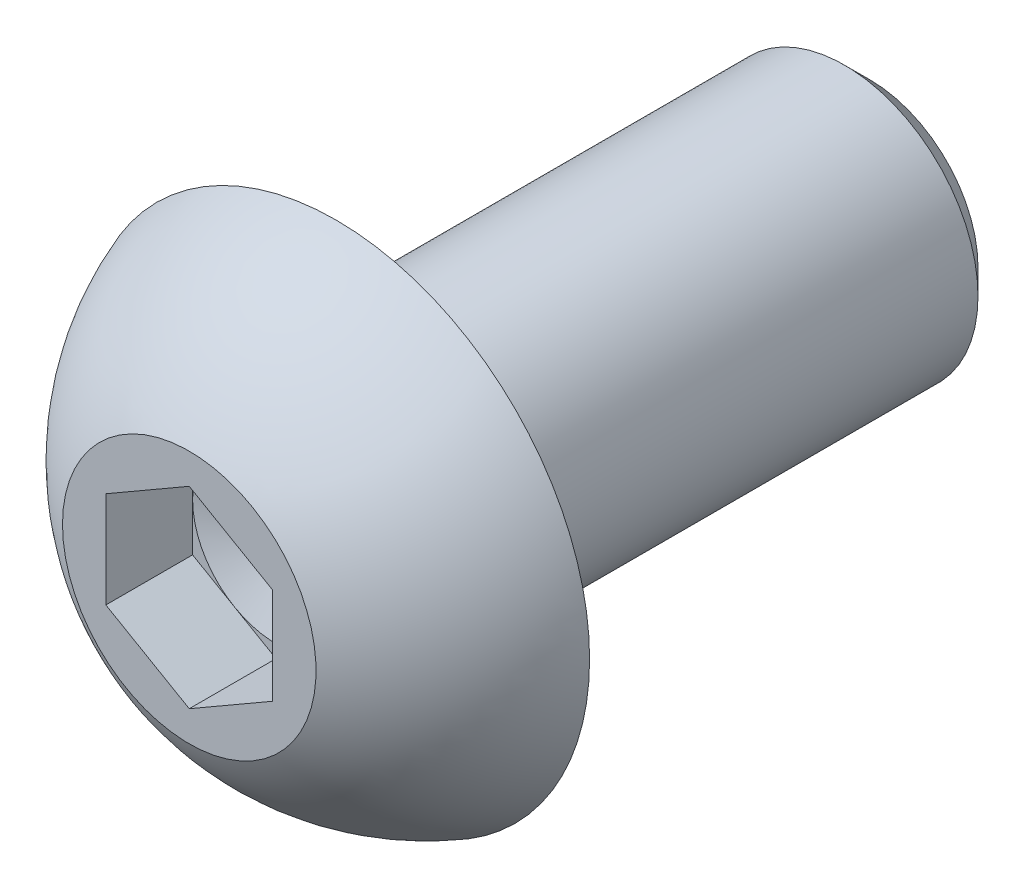
ISO-10303-21;
HEADER;
FILE_DESCRIPTION(('STEP AP214'),'2;1');
FILE_NAME('part.step','',(''),(''),'','','');
FILE_SCHEMA(('AUTOMOTIVE_DESIGN { 1 0 10303 214 1 1 1 1 }'));
ENDSEC;
DATA;
#1=APPLICATION_CONTEXT('core data for automotive mechanical design processes');
#2=APPLICATION_PROTOCOL_DEFINITION('international standard','automotive_design',2000,#1);
#3=PRODUCT_CONTEXT('',#1,'mechanical');
#4=PRODUCT('Part','Part','',(#3));
#5=PRODUCT_RELATED_PRODUCT_CATEGORY('part','',(#4));
#6=PRODUCT_DEFINITION_FORMATION('','',#4);
#7=PRODUCT_DEFINITION_CONTEXT('part definition',#1,'design');
#8=PRODUCT_DEFINITION('design','',#6,#7);
#9=PRODUCT_DEFINITION_SHAPE('','',#8);
#10=(LENGTH_UNIT() NAMED_UNIT(*) SI_UNIT(.MILLI.,.METRE.));
#11=(NAMED_UNIT(*) PLANE_ANGLE_UNIT() SI_UNIT($,.RADIAN.));
#12=(NAMED_UNIT(*) SI_UNIT($,.STERADIAN.) SOLID_ANGLE_UNIT());
#13=UNCERTAINTY_MEASURE_WITH_UNIT(LENGTH_MEASURE(1.E-05),#10,'distance_accuracy_value','');
#14=(GEOMETRIC_REPRESENTATION_CONTEXT(3) GLOBAL_UNCERTAINTY_ASSIGNED_CONTEXT((#13)) GLOBAL_UNIT_ASSIGNED_CONTEXT((#10,
#11,#12)) REPRESENTATION_CONTEXT('',''));
#15=CARTESIAN_POINT('',(0.,0.,0.));
#16=DIRECTION('',(0.,0.,1.));
#17=DIRECTION('',(1.,0.,0.));
#18=AXIS2_PLACEMENT_3D('',#15,#16,#17);
#19=CARTESIAN_POINT('',(0.,0.,-10.2));
#20=DIRECTION('',(0.,0.,1.));
#21=DIRECTION('',(1.,0.,0.));
#22=AXIS2_PLACEMENT_3D('',#19,#20,#21);
#23=CONICAL_SURFACE('',#22,1.6211138875,0.785398163397448);
#24=CARTESIAN_POINT('',(0.,0.,-10.2));
#25=DIRECTION('',(0.,0.,-1.));
#26=DIRECTION('',(1.,0.,0.));
#27=AXIS2_PLACEMENT_3D('',#24,#25,#26);
#28=CIRCLE('',#27,1.6211138875);
#29=CARTESIAN_POINT('',(1.6211138875,0.,-10.2));
#30=VERTEX_POINT('',#29);
#31=EDGE_CURVE('E313',#30,#30,#28,.T.);
#32=ORIENTED_EDGE('',*,*,#31,.F.);
#33=EDGE_LOOP('',(#32));
#34=FACE_BOUND('',#33,.T.);
#35=CARTESIAN_POINT('',(0.,0.,-9.8211138875));
#36=DIRECTION('',(0.,0.,1.));
#37=DIRECTION('',(1.,0.,0.));
#38=AXIS2_PLACEMENT_3D('',#35,#36,#37);
#39=CIRCLE('',#38,2.);
#40=CARTESIAN_POINT('',(2.,0.,-9.8211138875));
#41=VERTEX_POINT('',#40);
#42=EDGE_CURVE('E310',#41,#41,#39,.T.);
#43=ORIENTED_EDGE('',*,*,#42,.F.);
#44=EDGE_LOOP('',(#43));
#45=FACE_BOUND('',#44,.T.);
#46=ADVANCED_FACE('F17',(#34,#45),#23,.T.);
#47=CARTESIAN_POINT('',(0.,0.,-1.3));
#48=DIRECTION('',(0.,0.,1.));
#49=DIRECTION('',(1.,0.,0.));
#50=AXIS2_PLACEMENT_3D('',#47,#48,#49);
#51=CONICAL_SURFACE('',#50,1.25,1.22173047639603);
#52=CARTESIAN_POINT('',(0.,0.,-1.3));
#53=DIRECTION('',(0.,0.,1.));
#54=DIRECTION('',(1.,0.,0.));
#55=AXIS2_PLACEMENT_3D('',#52,#53,#54);
#56=CIRCLE('',#55,1.25);
#57=CARTESIAN_POINT('',(1.25,0.,-1.3));
#58=VERTEX_POINT('',#57);
#59=CARTESIAN_POINT('',(0.625,1.08253175473055,-1.3));
#60=VERTEX_POINT('',#59);
#61=EDGE_CURVE('E221',#58,#60,#56,.T.);
#62=ORIENTED_EDGE('',*,*,#61,.T.);
#63=CARTESIAN_POINT('',(0.,0.,-1.3));
#64=DIRECTION('',(0.,0.,1.));
#65=DIRECTION('',(1.,0.,0.));
#66=AXIS2_PLACEMENT_3D('',#63,#64,#65);
#67=CIRCLE('',#66,1.25);
#68=CARTESIAN_POINT('',(-0.625,1.08253175473055,-1.3));
#69=VERTEX_POINT('',#68);
#70=EDGE_CURVE('E235',#60,#69,#67,.T.);
#71=ORIENTED_EDGE('',*,*,#70,.T.);
#72=CARTESIAN_POINT('',(0.,0.,-1.3));
#73=DIRECTION('',(0.,0.,1.));
#74=DIRECTION('',(1.,0.,0.));
#75=AXIS2_PLACEMENT_3D('',#72,#73,#74);
#76=CIRCLE('',#75,1.25);
#77=CARTESIAN_POINT('',(-1.25,0.,-1.3));
#78=VERTEX_POINT('',#77);
#79=EDGE_CURVE('E257',#69,#78,#76,.T.);
#80=ORIENTED_EDGE('',*,*,#79,.T.);
#81=CARTESIAN_POINT('',(0.,0.,-1.3));
#82=DIRECTION('',(0.,0.,1.));
#83=DIRECTION('',(1.,0.,0.));
#84=AXIS2_PLACEMENT_3D('',#81,#82,#83);
#85=CIRCLE('',#84,1.25);
#86=CARTESIAN_POINT('',(-0.625,-1.08253175473055,-1.3));
#87=VERTEX_POINT('',#86);
#88=EDGE_CURVE('E243',#78,#87,#85,.T.);
#89=ORIENTED_EDGE('',*,*,#88,.T.);
#90=CARTESIAN_POINT('',(0.,0.,-1.3));
#91=DIRECTION('',(0.,0.,1.));
#92=DIRECTION('',(1.,0.,0.));
#93=AXIS2_PLACEMENT_3D('',#90,#91,#92);
#94=CIRCLE('',#93,1.25);
#95=CARTESIAN_POINT('',(0.625,-1.08253175473055,-1.3));
#96=VERTEX_POINT('',#95);
#97=EDGE_CURVE('E262',#87,#96,#94,.T.);
#98=ORIENTED_EDGE('',*,*,#97,.T.);
#99=CARTESIAN_POINT('',(0.,0.,-1.3));
#100=DIRECTION('',(0.,0.,1.));
#101=DIRECTION('',(1.,0.,0.));
#102=AXIS2_PLACEMENT_3D('',#99,#100,#101);
#103=CIRCLE('',#102,1.25);
#104=EDGE_CURVE('E11',#96,#58,#103,.T.);
#105=ORIENTED_EDGE('',*,*,#104,.T.);
#106=EDGE_LOOP('',(#62,#71,#80,#89,#98,#105));
#107=FACE_BOUND('',#106,.T.);
#108=CARTESIAN_POINT('',(0.,0.,-1.75496279283276));
#109=VERTEX_POINT('',#108);
#110=VERTEX_LOOP('',#109);
#111=FACE_BOUND('',#110,.T.);
#112=ADVANCED_FACE('F136',(#107,#111),#51,.F.);
#113=CARTESIAN_POINT('',(0.,0.,-1.3));
#114=DIRECTION('',(0.,0.,1.));
#115=DIRECTION('',(1.,0.,0.));
#116=AXIS2_PLACEMENT_3D('',#113,#114,#115);
#117=PLANE('',#116);
#118=ORIENTED_EDGE('',*,*,#104,.F.);
#119=DIRECTION('',(-0.866025403784439,-0.5,0.));
#120=VECTOR('',#119,1.);
#121=CARTESIAN_POINT('',(0.625,-1.08253175473055,-1.3));
#122=LINE('',#121,#120);
#123=CARTESIAN_POINT('',(1.25,-0.721687836487032,-1.3));
#124=VERTEX_POINT('',#123);
#125=EDGE_CURVE('E324',#124,#96,#122,.T.);
#126=ORIENTED_EDGE('',*,*,#125,.F.);
#127=DIRECTION('',(0.,-1.,0.));
#128=VECTOR('',#127,1.);
#129=CARTESIAN_POINT('',(1.25,0.,-1.3));
#130=LINE('',#129,#128);
#131=EDGE_CURVE('E26',#58,#124,#130,.T.);
#132=ORIENTED_EDGE('',*,*,#131,.F.);
#133=EDGE_LOOP('',(#118,#126,#132));
#134=FACE_BOUND('',#133,.T.);
#135=ADVANCED_FACE('F138',(#134),#117,.T.);
#136=CARTESIAN_POINT('',(1.25,0.,-1.3));
#137=DIRECTION('',(-1.,0.,0.));
#138=DIRECTION('',(0.,0.,1.));
#139=AXIS2_PLACEMENT_3D('',#136,#137,#138);
#140=PLANE('',#139);
#141=DIRECTION('',(0.,-1.,0.));
#142=VECTOR('',#141,1.);
#143=CARTESIAN_POINT('',(1.25,0.,0.));
#144=LINE('',#143,#142);
#145=CARTESIAN_POINT('',(1.25,0.721687836487032,0.));
#146=VERTEX_POINT('',#145);
#147=CARTESIAN_POINT('',(1.25,-0.721687836487032,0.));
#148=VERTEX_POINT('',#147);
#149=EDGE_CURVE('E284',#146,#148,#144,.T.);
#150=ORIENTED_EDGE('',*,*,#149,.F.);
#151=DIRECTION('',(0.,0.,1.));
#152=VECTOR('',#151,1.);
#153=CARTESIAN_POINT('',(1.25,0.721687836487032,-1.3));
#154=LINE('',#153,#152);
#155=CARTESIAN_POINT('',(1.25,0.721687836487032,-1.3));
#156=VERTEX_POINT('',#155);
#157=EDGE_CURVE('E314',#156,#146,#154,.T.);
#158=ORIENTED_EDGE('',*,*,#157,.F.);
#159=DIRECTION('',(0.,-1.,0.));
#160=VECTOR('',#159,1.);
#161=CARTESIAN_POINT('',(1.25,0.,-1.3));
#162=LINE('',#161,#160);
#163=EDGE_CURVE('E222',#156,#58,#162,.T.);
#164=ORIENTED_EDGE('',*,*,#163,.T.);
#165=ORIENTED_EDGE('',*,*,#131,.T.);
#166=DIRECTION('',(0.,0.,1.));
#167=VECTOR('',#166,1.);
#168=CARTESIAN_POINT('',(1.25,-0.721687836487032,-1.3));
#169=LINE('',#168,#167);
#170=EDGE_CURVE('E328',#124,#148,#169,.T.);
#171=ORIENTED_EDGE('',*,*,#170,.T.);
#172=EDGE_LOOP('',(#150,#158,#164,#165,#171));
#173=FACE_BOUND('',#172,.T.);
#174=ADVANCED_FACE('F145',(#173),#140,.T.);
#175=CARTESIAN_POINT('',(0.625,-1.08253175473055,-1.3));
#176=DIRECTION('',(-0.5,0.866025403784439,0.));
#177=DIRECTION('',(0.,0.,1.));
#178=AXIS2_PLACEMENT_3D('',#175,#176,#177);
#179=PLANE('',#178);
#180=DIRECTION('',(-0.866025403784439,-0.5,0.));
#181=VECTOR('',#180,1.);
#182=CARTESIAN_POINT('',(0.625,-1.08253175473055,0.));
#183=LINE('',#182,#181);
#184=CARTESIAN_POINT('',(0.,-1.44337567297406,0.));
#185=VERTEX_POINT('',#184);
#186=EDGE_CURVE('E288',#148,#185,#183,.T.);
#187=ORIENTED_EDGE('',*,*,#186,.F.);
#188=ORIENTED_EDGE('',*,*,#170,.F.);
#189=ORIENTED_EDGE('',*,*,#125,.T.);
#190=DIRECTION('',(-0.866025403784439,-0.5,0.));
#191=VECTOR('',#190,1.);
#192=CARTESIAN_POINT('',(0.625,-1.08253175473055,-1.3));
#193=LINE('',#192,#191);
#194=CARTESIAN_POINT('',(0.,-1.44337567297406,-1.3));
#195=VERTEX_POINT('',#194);
#196=EDGE_CURVE('E248',#96,#195,#193,.T.);
#197=ORIENTED_EDGE('',*,*,#196,.T.);
#198=DIRECTION('',(0.,0.,1.));
#199=VECTOR('',#198,1.);
#200=CARTESIAN_POINT('',(0.,-1.44337567297406,-1.3));
#201=LINE('',#200,#199);
#202=EDGE_CURVE('E336',#195,#185,#201,.T.);
#203=ORIENTED_EDGE('',*,*,#202,.T.);
#204=EDGE_LOOP('',(#187,#188,#189,#197,#203));
#205=FACE_BOUND('',#204,.T.);
#206=ADVANCED_FACE('F152',(#205),#179,.T.);
#207=CARTESIAN_POINT('',(-0.625,-1.08253175473055,-1.3));
#208=DIRECTION('',(0.5,0.866025403784439,0.));
#209=DIRECTION('',(0.,0.,-1.));
#210=AXIS2_PLACEMENT_3D('',#207,#208,#209);
#211=PLANE('',#210);
#212=DIRECTION('',(-0.866025403784439,0.5,0.));
#213=VECTOR('',#212,1.);
#214=CARTESIAN_POINT('',(-0.625,-1.08253175473055,0.));
#215=LINE('',#214,#213);
#216=CARTESIAN_POINT('',(-1.25,-0.721687836487033,0.));
#217=VERTEX_POINT('',#216);
#218=EDGE_CURVE('E292',#185,#217,#215,.T.);
#219=ORIENTED_EDGE('',*,*,#218,.F.);
#220=ORIENTED_EDGE('',*,*,#202,.F.);
#221=DIRECTION('',(-0.866025403784439,0.5,0.));
#222=VECTOR('',#221,1.);
#223=CARTESIAN_POINT('',(-0.625,-1.08253175473055,-1.3));
#224=LINE('',#223,#222);
#225=EDGE_CURVE('E253',#195,#87,#224,.T.);
#226=ORIENTED_EDGE('',*,*,#225,.T.);
#227=DIRECTION('',(-0.866025403784439,0.5,0.));
#228=VECTOR('',#227,1.);
#229=CARTESIAN_POINT('',(-0.625,-1.08253175473055,-1.3));
#230=LINE('',#229,#228);
#231=CARTESIAN_POINT('',(-1.25,-0.721687836487033,-1.3));
#232=VERTEX_POINT('',#231);
#233=EDGE_CURVE('E258',#87,#232,#230,.T.);
#234=ORIENTED_EDGE('',*,*,#233,.T.);
#235=DIRECTION('',(0.,0.,1.));
#236=VECTOR('',#235,1.);
#237=CARTESIAN_POINT('',(-1.25,-0.721687836487033,-1.3));
#238=LINE('',#237,#236);
#239=EDGE_CURVE('E333',#232,#217,#238,.T.);
#240=ORIENTED_EDGE('',*,*,#239,.T.);
#241=EDGE_LOOP('',(#219,#220,#226,#234,#240));
#242=FACE_BOUND('',#241,.T.);
#243=ADVANCED_FACE('F153',(#242),#211,.T.);
#244=CARTESIAN_POINT('',(-1.25,0.,-1.3));
#245=DIRECTION('',(1.,0.,0.));
#246=DIRECTION('',(0.,1.,0.));
#247=AXIS2_PLACEMENT_3D('',#244,#245,#246);
#248=PLANE('',#247);
#249=DIRECTION('',(0.,1.,0.));
#250=VECTOR('',#249,1.);
#251=CARTESIAN_POINT('',(-1.25,0.,0.));
#252=LINE('',#251,#250);
#253=CARTESIAN_POINT('',(-1.25,0.721687836487032,0.));
#254=VERTEX_POINT('',#253);
#255=EDGE_CURVE('E296',#217,#254,#252,.T.);
#256=ORIENTED_EDGE('',*,*,#255,.F.);
#257=ORIENTED_EDGE('',*,*,#239,.F.);
#258=DIRECTION('',(0.,1.,0.));
#259=VECTOR('',#258,1.);
#260=CARTESIAN_POINT('',(-1.25,0.,-1.3));
#261=LINE('',#260,#259);
#262=EDGE_CURVE('E263',#232,#78,#261,.T.);
#263=ORIENTED_EDGE('',*,*,#262,.T.);
#264=DIRECTION('',(0.,1.,0.));
#265=VECTOR('',#264,1.);
#266=CARTESIAN_POINT('',(-1.25,0.,-1.3));
#267=LINE('',#266,#265);
#268=CARTESIAN_POINT('',(-1.25,0.721687836487032,-1.3));
#269=VERTEX_POINT('',#268);
#270=EDGE_CURVE('E239',#78,#269,#267,.T.);
#271=ORIENTED_EDGE('',*,*,#270,.T.);
#272=DIRECTION('',(0.,0.,1.));
#273=VECTOR('',#272,1.);
#274=CARTESIAN_POINT('',(-1.25,0.721687836487032,-1.3));
#275=LINE('',#274,#273);
#276=EDGE_CURVE('E317',#269,#254,#275,.T.);
#277=ORIENTED_EDGE('',*,*,#276,.T.);
#278=EDGE_LOOP('',(#256,#257,#263,#271,#277));
#279=FACE_BOUND('',#278,.T.);
#280=ADVANCED_FACE('F156',(#279),#248,.T.);
#281=CARTESIAN_POINT('',(-0.625,1.08253175473055,-1.3));
#282=DIRECTION('',(0.5,-0.866025403784439,0.));
#283=DIRECTION('',(0.,0.,-1.));
#284=AXIS2_PLACEMENT_3D('',#281,#282,#283);
#285=PLANE('',#284);
#286=DIRECTION('',(0.866025403784439,0.5,0.));
#287=VECTOR('',#286,1.);
#288=CARTESIAN_POINT('',(-0.625,1.08253175473055,0.));
#289=LINE('',#288,#287);
#290=CARTESIAN_POINT('',(0.,1.44337567297406,0.));
#291=VERTEX_POINT('',#290);
#292=EDGE_CURVE('E300',#254,#291,#289,.T.);
#293=ORIENTED_EDGE('',*,*,#292,.F.);
#294=ORIENTED_EDGE('',*,*,#276,.F.);
#295=DIRECTION('',(0.866025403784439,0.5,0.));
#296=VECTOR('',#295,1.);
#297=CARTESIAN_POINT('',(-0.625,1.08253175473055,-1.3));
#298=LINE('',#297,#296);
#299=EDGE_CURVE('E244',#269,#69,#298,.T.);
#300=ORIENTED_EDGE('',*,*,#299,.T.);
#301=DIRECTION('',(0.866025403784439,0.5,0.));
#302=VECTOR('',#301,1.);
#303=CARTESIAN_POINT('',(-0.625,1.08253175473055,-1.3));
#304=LINE('',#303,#302);
#305=CARTESIAN_POINT('',(0.,1.44337567297406,-1.3));
#306=VERTEX_POINT('',#305);
#307=EDGE_CURVE('E247',#69,#306,#304,.T.);
#308=ORIENTED_EDGE('',*,*,#307,.T.);
#309=DIRECTION('',(0.,0.,1.));
#310=VECTOR('',#309,1.);
#311=CARTESIAN_POINT('',(0.,1.44337567297406,-1.3));
#312=LINE('',#311,#310);
#313=EDGE_CURVE('E318',#306,#291,#312,.T.);
#314=ORIENTED_EDGE('',*,*,#313,.T.);
#315=EDGE_LOOP('',(#293,#294,#300,#308,#314));
#316=FACE_BOUND('',#315,.T.);
#317=ADVANCED_FACE('F165',(#316),#285,.T.);
#318=CARTESIAN_POINT('',(0.625,1.08253175473055,-1.3));
#319=DIRECTION('',(-0.5,-0.866025403784439,0.));
#320=DIRECTION('',(-0.866025403784439,0.5,0.));
#321=AXIS2_PLACEMENT_3D('',#318,#319,#320);
#322=PLANE('',#321);
#323=DIRECTION('',(0.866025403784439,-0.5,0.));
#324=VECTOR('',#323,1.);
#325=CARTESIAN_POINT('',(0.625,1.08253175473055,0.));
#326=LINE('',#325,#324);
#327=EDGE_CURVE('E280',#291,#146,#326,.T.);
#328=ORIENTED_EDGE('',*,*,#327,.F.);
#329=ORIENTED_EDGE('',*,*,#313,.F.);
#330=DIRECTION('',(0.866025403784439,-0.5,0.));
#331=VECTOR('',#330,1.);
#332=CARTESIAN_POINT('',(0.625,1.08253175473055,-1.3));
#333=LINE('',#332,#331);
#334=EDGE_CURVE('E238',#306,#60,#333,.T.);
#335=ORIENTED_EDGE('',*,*,#334,.T.);
#336=DIRECTION('',(0.866025403784439,-0.5,0.));
#337=VECTOR('',#336,1.);
#338=CARTESIAN_POINT('',(0.625,1.08253175473055,-1.3));
#339=LINE('',#338,#337);
#340=EDGE_CURVE('E224',#60,#156,#339,.T.);
#341=ORIENTED_EDGE('',*,*,#340,.T.);
#342=ORIENTED_EDGE('',*,*,#157,.T.);
#343=EDGE_LOOP('',(#328,#329,#335,#341,#342));
#344=FACE_BOUND('',#343,.T.);
#345=ADVANCED_FACE('F161',(#344),#322,.T.);
#346=CARTESIAN_POINT('',(-1.97727344006639,0.,-2.2));
#347=DIRECTION('',(0.,0.,-1.));
#348=DIRECTION('',(0.,-1.,0.));
#349=AXIS2_PLACEMENT_3D('',#346,#347,#348);
#350=PLANE('',#349);
#351=CARTESIAN_POINT('',(0.,0.,-2.2));
#352=DIRECTION('',(0.,0.,-1.));
#353=DIRECTION('',(-1.,0.,0.));
#354=AXIS2_PLACEMENT_3D('',#351,#352,#353);
#355=CIRCLE('',#354,2.2);
#356=CARTESIAN_POINT('',(-2.2,0.,-2.2));
#357=VERTEX_POINT('',#356);
#358=EDGE_CURVE('E304',#357,#357,#355,.T.);
#359=ORIENTED_EDGE('',*,*,#358,.F.);
#360=EDGE_LOOP('',(#359));
#361=FACE_BOUND('',#360,.T.);
#362=CARTESIAN_POINT('',(0.,0.,-2.2));
#363=DIRECTION('',(0.,0.,-1.));
#364=DIRECTION('',(-1.,0.,0.));
#365=AXIS2_PLACEMENT_3D('',#362,#363,#364);
#366=CIRCLE('',#365,3.8);
#367=CARTESIAN_POINT('',(-3.8,0.,-2.2));
#368=VERTEX_POINT('',#367);
#369=EDGE_CURVE('E321',#368,#368,#366,.T.);
#370=ORIENTED_EDGE('',*,*,#369,.T.);
#371=EDGE_LOOP('',(#370));
#372=FACE_BOUND('',#371,.T.);
#373=ADVANCED_FACE('F164',(#361,#372),#350,.T.);
#374=CARTESIAN_POINT('',(0.,0.,-3.56136363636364));
#375=DIRECTION('',(0.,0.,-1.));
#376=DIRECTION('',(-1.,0.,0.));
#377=AXIS2_PLACEMENT_3D('',#374,#375,#376);
#378=SPHERICAL_SURFACE('',#377,4.03649736162595);
#379=CARTESIAN_POINT('',(0.,0.,0.));
#380=DIRECTION('',(0.,0.,-1.));
#381=DIRECTION('',(-1.,0.,0.));
#382=AXIS2_PLACEMENT_3D('',#379,#380,#381);
#383=CIRCLE('',#382,1.9);
#384=CARTESIAN_POINT('',(-1.9,0.,0.));
#385=VERTEX_POINT('',#384);
#386=EDGE_CURVE('E252',#385,#385,#383,.T.);
#387=ORIENTED_EDGE('',*,*,#386,.T.);
#388=EDGE_LOOP('',(#387));
#389=FACE_BOUND('',#388,.T.);
#390=ORIENTED_EDGE('',*,*,#369,.F.);
#391=EDGE_LOOP('',(#390));
#392=FACE_BOUND('',#391,.T.);
#393=ADVANCED_FACE('F167',(#389,#392),#378,.T.);
#394=CARTESIAN_POINT('',(-0.87081455068829,0.,-10.2));
#395=DIRECTION('',(0.,0.,1.));
#396=DIRECTION('',(1.,0.,0.));
#397=AXIS2_PLACEMENT_3D('',#394,#395,#396);
#398=PLANE('',#397);
#399=ORIENTED_EDGE('',*,*,#31,.T.);
#400=EDGE_LOOP('',(#399));
#401=FACE_BOUND('',#400,.T.);
#402=ADVANCED_FACE('F170',(#401),#398,.F.);
#403=CARTESIAN_POINT('',(0.,0.,1.27209592840993));
#404=DIRECTION('',(0.,0.,-1.));
#405=DIRECTION('',(-1.,0.,0.));
#406=AXIS2_PLACEMENT_3D('',#403,#404,#405);
#407=CYLINDRICAL_SURFACE('',#406,2.);
#408=CARTESIAN_POINT('',(0.,0.,-2.4));
#409=DIRECTION('',(0.,0.,-1.));
#410=DIRECTION('',(-1.,0.,0.));
#411=AXIS2_PLACEMENT_3D('',#408,#409,#410);
#412=CIRCLE('',#411,2.);
#413=CARTESIAN_POINT('',(-2.,0.,-2.4));
#414=VERTEX_POINT('',#413);
#415=EDGE_CURVE('E307',#414,#414,#412,.T.);
#416=ORIENTED_EDGE('',*,*,#415,.T.);
#417=EDGE_LOOP('',(#416));
#418=FACE_BOUND('',#417,.T.);
#419=ORIENTED_EDGE('',*,*,#42,.T.);
#420=EDGE_LOOP('',(#419));
#421=FACE_BOUND('',#420,.T.);
#422=ADVANCED_FACE('F172',(#418,#421),#407,.T.);
#423=CARTESIAN_POINT('',(0.,0.,-2.4));
#424=DIRECTION('',(0.,0.,-1.));
#425=DIRECTION('',(-1.,0.,0.));
#426=AXIS2_PLACEMENT_3D('',#423,#424,#425);
#427=TOROIDAL_SURFACE('',#426,2.2,0.2);
#428=ORIENTED_EDGE('',*,*,#415,.F.);
#429=EDGE_LOOP('',(#428));
#430=FACE_BOUND('',#429,.T.);
#431=ORIENTED_EDGE('',*,*,#358,.T.);
#432=EDGE_LOOP('',(#431));
#433=FACE_BOUND('',#432,.T.);
#434=ADVANCED_FACE('F175',(#430,#433),#427,.F.);
#435=CARTESIAN_POINT('',(-0.65,0.,0.));
#436=DIRECTION('',(0.,0.,-1.));
#437=DIRECTION('',(0.,-1.,0.));
#438=AXIS2_PLACEMENT_3D('',#435,#436,#437);
#439=PLANE('',#438);
#440=ORIENTED_EDGE('',*,*,#327,.T.);
#441=ORIENTED_EDGE('',*,*,#149,.T.);
#442=ORIENTED_EDGE('',*,*,#186,.T.);
#443=ORIENTED_EDGE('',*,*,#218,.T.);
#444=ORIENTED_EDGE('',*,*,#255,.T.);
#445=ORIENTED_EDGE('',*,*,#292,.T.);
#446=EDGE_LOOP('',(#440,#441,#442,#443,#444,#445));
#447=FACE_BOUND('',#446,.T.);
#448=ORIENTED_EDGE('',*,*,#386,.F.);
#449=EDGE_LOOP('',(#448));
#450=FACE_BOUND('',#449,.T.);
#451=ADVANCED_FACE('F180',(#447,#450),#439,.F.);
#452=CARTESIAN_POINT('',(0.,0.,-1.3));
#453=DIRECTION('',(0.,0.,1.));
#454=DIRECTION('',(1.,0.,0.));
#455=AXIS2_PLACEMENT_3D('',#452,#453,#454);
#456=PLANE('',#455);
#457=ORIENTED_EDGE('',*,*,#97,.F.);
#458=ORIENTED_EDGE('',*,*,#225,.F.);
#459=ORIENTED_EDGE('',*,*,#196,.F.);
#460=EDGE_LOOP('',(#457,#458,#459));
#461=FACE_BOUND('',#460,.T.);
#462=ADVANCED_FACE('F183',(#461),#456,.T.);
#463=CARTESIAN_POINT('',(0.,0.,-1.3));
#464=DIRECTION('',(0.,0.,1.));
#465=DIRECTION('',(1.,0.,0.));
#466=AXIS2_PLACEMENT_3D('',#463,#464,#465);
#467=PLANE('',#466);
#468=ORIENTED_EDGE('',*,*,#88,.F.);
#469=ORIENTED_EDGE('',*,*,#262,.F.);
#470=ORIENTED_EDGE('',*,*,#233,.F.);
#471=EDGE_LOOP('',(#468,#469,#470));
#472=FACE_BOUND('',#471,.T.);
#473=ADVANCED_FACE('F190',(#472),#467,.T.);
#474=CARTESIAN_POINT('',(0.,0.,-1.3));
#475=DIRECTION('',(0.,0.,1.));
#476=DIRECTION('',(1.,0.,0.));
#477=AXIS2_PLACEMENT_3D('',#474,#475,#476);
#478=PLANE('',#477);
#479=ORIENTED_EDGE('',*,*,#79,.F.);
#480=ORIENTED_EDGE('',*,*,#299,.F.);
#481=ORIENTED_EDGE('',*,*,#270,.F.);
#482=EDGE_LOOP('',(#479,#480,#481));
#483=FACE_BOUND('',#482,.T.);
#484=ADVANCED_FACE('F200',(#483),#478,.T.);
#485=CARTESIAN_POINT('',(0.,0.,-1.3));
#486=DIRECTION('',(0.,0.,1.));
#487=DIRECTION('',(1.,0.,0.));
#488=AXIS2_PLACEMENT_3D('',#485,#486,#487);
#489=PLANE('',#488);
#490=ORIENTED_EDGE('',*,*,#70,.F.);
#491=ORIENTED_EDGE('',*,*,#334,.F.);
#492=ORIENTED_EDGE('',*,*,#307,.F.);
#493=EDGE_LOOP('',(#490,#491,#492));
#494=FACE_BOUND('',#493,.T.);
#495=ADVANCED_FACE('F202',(#494),#489,.T.);
#496=CARTESIAN_POINT('',(0.,0.,-1.3));
#497=DIRECTION('',(0.,0.,1.));
#498=DIRECTION('',(1.,0.,0.));
#499=AXIS2_PLACEMENT_3D('',#496,#497,#498);
#500=PLANE('',#499);
#501=ORIENTED_EDGE('',*,*,#61,.F.);
#502=ORIENTED_EDGE('',*,*,#163,.F.);
#503=ORIENTED_EDGE('',*,*,#340,.F.);
#504=EDGE_LOOP('',(#501,#502,#503));
#505=FACE_BOUND('',#504,.T.);
#506=ADVANCED_FACE('F205',(#505),#500,.T.);
#507=CLOSED_SHELL('',(#46,#112,#135,#174,#206,#243,#280,#317,#345,#373,#393,#402,#422,#434,#451,
#462,#473,#484,#495,#506));
#508=MANIFOLD_SOLID_BREP('B1',#507);
#509=ADVANCED_BREP_SHAPE_REPRESENTATION('',(#18,#508),#14);
#510=SHAPE_DEFINITION_REPRESENTATION(#9,#509);
ENDSEC;
END-ISO-10303-21;
